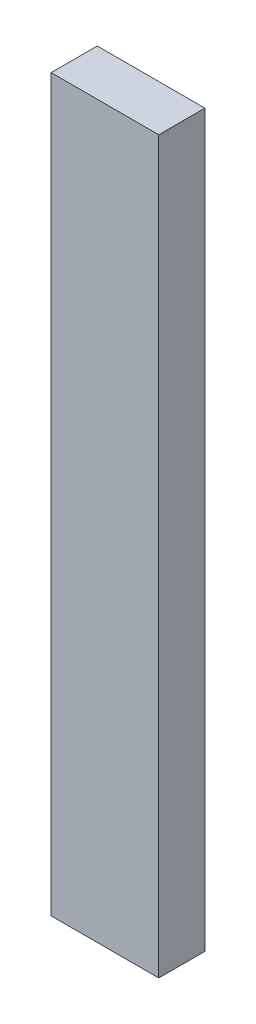
ISO-10303-21;
HEADER;
FILE_DESCRIPTION(('STEP AP214'),'2;1');
FILE_NAME('part.step','',(''),(''),'','','');
FILE_SCHEMA(('AUTOMOTIVE_DESIGN { 1 0 10303 214 1 1 1 1 }'));
ENDSEC;
DATA;
#1=APPLICATION_CONTEXT('core data for automotive mechanical design processes');
#2=APPLICATION_PROTOCOL_DEFINITION('international standard','automotive_design',2000,#1);
#3=PRODUCT_CONTEXT('',#1,'mechanical');
#4=PRODUCT('Part','Part','',(#3));
#5=PRODUCT_RELATED_PRODUCT_CATEGORY('part','',(#4));
#6=PRODUCT_DEFINITION_FORMATION('','',#4);
#7=PRODUCT_DEFINITION_CONTEXT('part definition',#1,'design');
#8=PRODUCT_DEFINITION('design','',#6,#7);
#9=PRODUCT_DEFINITION_SHAPE('','',#8);
#10=(LENGTH_UNIT() NAMED_UNIT(*) SI_UNIT(.MILLI.,.METRE.));
#11=(NAMED_UNIT(*) PLANE_ANGLE_UNIT() SI_UNIT($,.RADIAN.));
#12=(NAMED_UNIT(*) SI_UNIT($,.STERADIAN.) SOLID_ANGLE_UNIT());
#13=UNCERTAINTY_MEASURE_WITH_UNIT(LENGTH_MEASURE(1.E-05),#10,'distance_accuracy_value','');
#14=(GEOMETRIC_REPRESENTATION_CONTEXT(3) GLOBAL_UNCERTAINTY_ASSIGNED_CONTEXT((#13)) GLOBAL_UNIT_ASSIGNED_CONTEXT((#10,
#11,#12)) REPRESENTATION_CONTEXT('',''));
#15=CARTESIAN_POINT('',(0.,0.,0.));
#16=DIRECTION('',(0.,0.,1.));
#17=DIRECTION('',(1.,0.,0.));
#18=AXIS2_PLACEMENT_3D('',#15,#16,#17);
#19=CARTESIAN_POINT('',(44.45,603.25,19.05));
#20=DIRECTION('',(-1.,0.,0.));
#21=DIRECTION('',(0.,0.,1.));
#22=AXIS2_PLACEMENT_3D('',#19,#20,#21);
#23=PLANE('',#22);
#24=DIRECTION('',(0.,0.,-1.));
#25=VECTOR('',#24,1.);
#26=CARTESIAN_POINT('',(44.45,0.,19.05));
#27=LINE('',#26,#25);
#28=CARTESIAN_POINT('',(44.45,0.,19.05));
#29=VERTEX_POINT('',#28);
#30=CARTESIAN_POINT('',(44.45,0.,-19.05));
#31=VERTEX_POINT('',#30);
#32=EDGE_CURVE('E107',#29,#31,#27,.T.);
#33=ORIENTED_EDGE('',*,*,#32,.T.);
#34=DIRECTION('',(0.,-1.,0.));
#35=VECTOR('',#34,1.);
#36=CARTESIAN_POINT('',(44.45,603.25,-19.05));
#37=LINE('',#36,#35);
#38=CARTESIAN_POINT('',(44.45,603.25,-19.05));
#39=VERTEX_POINT('',#38);
#40=EDGE_CURVE('E11',#39,#31,#37,.T.);
#41=ORIENTED_EDGE('',*,*,#40,.F.);
#42=DIRECTION('',(0.,0.,-1.));
#43=VECTOR('',#42,1.);
#44=CARTESIAN_POINT('',(44.45,603.25,19.05));
#45=LINE('',#44,#43);
#46=CARTESIAN_POINT('',(44.45,603.25,19.05));
#47=VERTEX_POINT('',#46);
#48=EDGE_CURVE('E91',#47,#39,#45,.T.);
#49=ORIENTED_EDGE('',*,*,#48,.F.);
#50=DIRECTION('',(0.,-1.,0.));
#51=VECTOR('',#50,1.);
#52=CARTESIAN_POINT('',(44.45,603.25,19.05));
#53=LINE('',#52,#51);
#54=EDGE_CURVE('E103',#47,#29,#53,.T.);
#55=ORIENTED_EDGE('',*,*,#54,.T.);
#56=EDGE_LOOP('',(#33,#41,#49,#55));
#57=FACE_BOUND('',#56,.T.);
#58=ADVANCED_FACE('F39',(#57),#23,.F.);
#59=CARTESIAN_POINT('',(-44.45,603.25,-19.05));
#60=DIRECTION('',(0.,0.,1.));
#61=DIRECTION('',(1.,0.,0.));
#62=AXIS2_PLACEMENT_3D('',#59,#60,#61);
#63=PLANE('',#62);
#64=DIRECTION('',(-1.,0.,0.));
#65=VECTOR('',#64,1.);
#66=CARTESIAN_POINT('',(-44.45,0.,-19.05));
#67=LINE('',#66,#65);
#68=CARTESIAN_POINT('',(-44.45,0.,-19.05));
#69=VERTEX_POINT('',#68);
#70=EDGE_CURVE('E96',#31,#69,#67,.T.);
#71=ORIENTED_EDGE('',*,*,#70,.T.);
#72=DIRECTION('',(0.,-1.,0.));
#73=VECTOR('',#72,1.);
#74=CARTESIAN_POINT('',(-44.45,603.25,-19.05));
#75=LINE('',#74,#73);
#76=CARTESIAN_POINT('',(-44.45,603.25,-19.05));
#77=VERTEX_POINT('',#76);
#78=EDGE_CURVE('E48',#77,#69,#75,.T.);
#79=ORIENTED_EDGE('',*,*,#78,.F.);
#80=DIRECTION('',(-1.,0.,0.));
#81=VECTOR('',#80,1.);
#82=CARTESIAN_POINT('',(-44.45,603.25,-19.05));
#83=LINE('',#82,#81);
#84=EDGE_CURVE('E86',#39,#77,#83,.T.);
#85=ORIENTED_EDGE('',*,*,#84,.F.);
#86=ORIENTED_EDGE('',*,*,#40,.T.);
#87=EDGE_LOOP('',(#71,#79,#85,#86));
#88=FACE_BOUND('',#87,.T.);
#89=ADVANCED_FACE('F95',(#88),#63,.F.);
#90=CARTESIAN_POINT('',(-44.45,603.25,19.05));
#91=DIRECTION('',(1.,0.,0.));
#92=DIRECTION('',(0.,0.,-1.));
#93=AXIS2_PLACEMENT_3D('',#90,#91,#92);
#94=PLANE('',#93);
#95=DIRECTION('',(0.,0.,1.));
#96=VECTOR('',#95,1.);
#97=CARTESIAN_POINT('',(-44.45,0.,19.05));
#98=LINE('',#97,#96);
#99=CARTESIAN_POINT('',(-44.45,0.,19.05));
#100=VERTEX_POINT('',#99);
#101=EDGE_CURVE('E73',#69,#100,#98,.T.);
#102=ORIENTED_EDGE('',*,*,#101,.T.);
#103=DIRECTION('',(0.,-1.,0.));
#104=VECTOR('',#103,1.);
#105=CARTESIAN_POINT('',(-44.45,603.25,19.05));
#106=LINE('',#105,#104);
#107=CARTESIAN_POINT('',(-44.45,603.25,19.05));
#108=VERTEX_POINT('',#107);
#109=EDGE_CURVE('E98',#108,#100,#106,.T.);
#110=ORIENTED_EDGE('',*,*,#109,.F.);
#111=DIRECTION('',(0.,0.,1.));
#112=VECTOR('',#111,1.);
#113=CARTESIAN_POINT('',(-44.45,603.25,19.05));
#114=LINE('',#113,#112);
#115=EDGE_CURVE('E89',#77,#108,#114,.T.);
#116=ORIENTED_EDGE('',*,*,#115,.F.);
#117=ORIENTED_EDGE('',*,*,#78,.T.);
#118=EDGE_LOOP('',(#102,#110,#116,#117));
#119=FACE_BOUND('',#118,.T.);
#120=ADVANCED_FACE('F99',(#119),#94,.F.);
#121=CARTESIAN_POINT('',(-44.45,603.25,19.05));
#122=DIRECTION('',(0.,0.,-1.));
#123=DIRECTION('',(-1.,0.,0.));
#124=AXIS2_PLACEMENT_3D('',#121,#122,#123);
#125=PLANE('',#124);
#126=DIRECTION('',(1.,0.,0.));
#127=VECTOR('',#126,1.);
#128=CARTESIAN_POINT('',(-44.45,0.,19.05));
#129=LINE('',#128,#127);
#130=EDGE_CURVE('E79',#100,#29,#129,.T.);
#131=ORIENTED_EDGE('',*,*,#130,.T.);
#132=ORIENTED_EDGE('',*,*,#54,.F.);
#133=DIRECTION('',(1.,0.,0.));
#134=VECTOR('',#133,1.);
#135=CARTESIAN_POINT('',(-44.45,603.25,19.05));
#136=LINE('',#135,#134);
#137=EDGE_CURVE('E56',#108,#47,#136,.T.);
#138=ORIENTED_EDGE('',*,*,#137,.F.);
#139=ORIENTED_EDGE('',*,*,#109,.T.);
#140=EDGE_LOOP('',(#131,#132,#138,#139));
#141=FACE_BOUND('',#140,.T.);
#142=ADVANCED_FACE('F120',(#141),#125,.F.);
#143=CARTESIAN_POINT('',(0.,603.25,0.));
#144=DIRECTION('',(0.,-1.,0.));
#145=DIRECTION('',(0.,0.,-1.));
#146=AXIS2_PLACEMENT_3D('',#143,#144,#145);
#147=PLANE('',#146);
#148=ORIENTED_EDGE('',*,*,#48,.T.);
#149=ORIENTED_EDGE('',*,*,#84,.T.);
#150=ORIENTED_EDGE('',*,*,#115,.T.);
#151=ORIENTED_EDGE('',*,*,#137,.T.);
#152=EDGE_LOOP('',(#148,#149,#150,#151));
#153=FACE_BOUND('',#152,.T.);
#154=ADVANCED_FACE('F87',(#153),#147,.F.);
#155=CARTESIAN_POINT('',(0.,0.,0.));
#156=DIRECTION('',(0.,-1.,0.));
#157=DIRECTION('',(0.,0.,-1.));
#158=AXIS2_PLACEMENT_3D('',#155,#156,#157);
#159=PLANE('',#158);
#160=ORIENTED_EDGE('',*,*,#32,.F.);
#161=ORIENTED_EDGE('',*,*,#130,.F.);
#162=ORIENTED_EDGE('',*,*,#101,.F.);
#163=ORIENTED_EDGE('',*,*,#70,.F.);
#164=EDGE_LOOP('',(#160,#161,#162,#163));
#165=FACE_BOUND('',#164,.T.);
#166=ADVANCED_FACE('F123',(#165),#159,.T.);
#167=CLOSED_SHELL('',(#58,#89,#120,#142,#154,#166));
#168=MANIFOLD_SOLID_BREP('B2',#167);
#169=ADVANCED_BREP_SHAPE_REPRESENTATION('',(#18,#168),#14);
#170=SHAPE_DEFINITION_REPRESENTATION(#9,#169);
ENDSEC;
END-ISO-10303-21;
